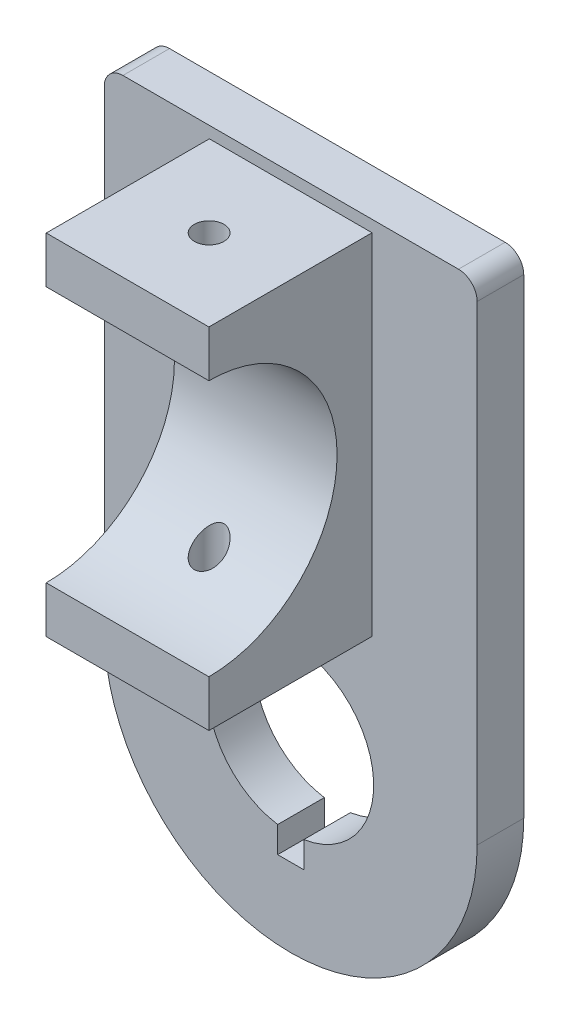
ISO-10303-21;
HEADER;
FILE_DESCRIPTION(('STEP AP214'),'2;1');
FILE_NAME('part.step','',(''),(''),'','','');
FILE_SCHEMA(('AUTOMOTIVE_DESIGN { 1 0 10303 214 1 1 1 1 }'));
ENDSEC;
DATA;
#1=APPLICATION_CONTEXT('core data for automotive mechanical design processes');
#2=APPLICATION_PROTOCOL_DEFINITION('international standard','automotive_design',2000,#1);
#3=PRODUCT_CONTEXT('',#1,'mechanical');
#4=PRODUCT('Part','Part','',(#3));
#5=PRODUCT_RELATED_PRODUCT_CATEGORY('part','',(#4));
#6=PRODUCT_DEFINITION_FORMATION('','',#4);
#7=PRODUCT_DEFINITION_CONTEXT('part definition',#1,'design');
#8=PRODUCT_DEFINITION('design','',#6,#7);
#9=PRODUCT_DEFINITION_SHAPE('','',#8);
#10=(LENGTH_UNIT() NAMED_UNIT(*) SI_UNIT(.MILLI.,.METRE.));
#11=(NAMED_UNIT(*) PLANE_ANGLE_UNIT() SI_UNIT($,.RADIAN.));
#12=(NAMED_UNIT(*) SI_UNIT($,.STERADIAN.) SOLID_ANGLE_UNIT());
#13=UNCERTAINTY_MEASURE_WITH_UNIT(LENGTH_MEASURE(1.E-05),#10,'distance_accuracy_value','');
#14=(GEOMETRIC_REPRESENTATION_CONTEXT(3) GLOBAL_UNCERTAINTY_ASSIGNED_CONTEXT((#13)) GLOBAL_UNIT_ASSIGNED_CONTEXT((#10,
#11,#12)) REPRESENTATION_CONTEXT('',''));
#15=CARTESIAN_POINT('',(0.,0.,0.));
#16=DIRECTION('',(0.,0.,1.));
#17=DIRECTION('',(1.,0.,0.));
#18=AXIS2_PLACEMENT_3D('',#15,#16,#17);
#19=CARTESIAN_POINT('',(14.31925,65.0875,28.575));
#20=DIRECTION('',(0.,-1.,0.));
#21=DIRECTION('',(0.,0.,-1.));
#22=AXIS2_PLACEMENT_3D('',#19,#20,#21);
#23=PLANE('',#22);
#24=DIRECTION('',(-1.,0.,0.));
#25=VECTOR('',#24,1.);
#26=CARTESIAN_POINT('',(14.31925,65.0875,6.35));
#27=LINE('',#26,#25);
#28=CARTESIAN_POINT('',(36.48075,65.0875,6.35));
#29=VERTEX_POINT('',#28);
#30=CARTESIAN_POINT('',(14.31925,65.0875,6.35));
#31=VERTEX_POINT('',#30);
#32=EDGE_CURVE('E95',#29,#31,#27,.T.);
#33=ORIENTED_EDGE('',*,*,#32,.T.);
#34=DIRECTION('',(0.,0.,-1.));
#35=VECTOR('',#34,1.);
#36=CARTESIAN_POINT('',(14.31925,65.0875,28.575));
#37=LINE('',#36,#35);
#38=CARTESIAN_POINT('',(14.31925,65.0875,28.575));
#39=VERTEX_POINT('',#38);
#40=EDGE_CURVE('E134',#39,#31,#37,.T.);
#41=ORIENTED_EDGE('',*,*,#40,.F.);
#42=DIRECTION('',(-1.,0.,0.));
#43=VECTOR('',#42,1.);
#44=CARTESIAN_POINT('',(14.31925,65.0875,28.575));
#45=LINE('',#44,#43);
#46=CARTESIAN_POINT('',(36.48075,65.0875,28.575));
#47=VERTEX_POINT('',#46);
#48=EDGE_CURVE('E74',#47,#39,#45,.T.);
#49=ORIENTED_EDGE('',*,*,#48,.F.);
#50=DIRECTION('',(0.,0.,-1.));
#51=VECTOR('',#50,1.);
#52=CARTESIAN_POINT('',(36.48075,65.0875,28.575));
#53=LINE('',#52,#51);
#54=EDGE_CURVE('E143',#47,#29,#53,.T.);
#55=ORIENTED_EDGE('',*,*,#54,.T.);
#56=EDGE_LOOP('',(#33,#41,#49,#55));
#57=FACE_BOUND('',#56,.T.);
#58=CARTESIAN_POINT('',(25.4,65.0875,17.4625));
#59=DIRECTION('',(0.,1.,0.));
#60=DIRECTION('',(0.,0.,1.));
#61=AXIS2_PLACEMENT_3D('',#58,#59,#60);
#62=CIRCLE('',#61,2.0193);
#63=CARTESIAN_POINT('',(25.4,65.0875,19.4818));
#64=VERTEX_POINT('',#63);
#65=EDGE_CURVE('E165',#64,#64,#62,.T.);
#66=ORIENTED_EDGE('',*,*,#65,.F.);
#67=EDGE_LOOP('',(#66));
#68=FACE_BOUND('',#67,.T.);
#69=ADVANCED_FACE('F51',(#57,#68),#23,.F.);
#70=CARTESIAN_POINT('',(0.,0.,28.575));
#71=DIRECTION('',(0.,0.,-1.));
#72=DIRECTION('',(-1.,0.,0.));
#73=AXIS2_PLACEMENT_3D('',#70,#71,#72);
#74=PLANE('',#73);
#75=DIRECTION('',(1.,0.,0.));
#76=VECTOR('',#75,1.);
#77=CARTESIAN_POINT('',(-167.497143269986,23.8125,28.575));
#78=LINE('',#77,#76);
#79=CARTESIAN_POINT('',(14.31925,23.8125,28.575));
#80=VERTEX_POINT('',#79);
#81=CARTESIAN_POINT('',(36.48075,23.8125,28.575));
#82=VERTEX_POINT('',#81);
#83=EDGE_CURVE('E66',#80,#82,#78,.T.);
#84=ORIENTED_EDGE('',*,*,#83,.F.);
#85=DIRECTION('',(0.,-1.,0.));
#86=VECTOR('',#85,1.);
#87=CARTESIAN_POINT('',(14.31925,17.4625,28.575));
#88=LINE('',#87,#86);
#89=CARTESIAN_POINT('',(14.31925,17.4625,28.575));
#90=VERTEX_POINT('',#89);
#91=EDGE_CURVE('E102',#80,#90,#88,.T.);
#92=ORIENTED_EDGE('',*,*,#91,.T.);
#93=DIRECTION('',(1.,0.,0.));
#94=VECTOR('',#93,1.);
#95=CARTESIAN_POINT('',(14.31925,17.4625,28.575));
#96=LINE('',#95,#94);
#97=CARTESIAN_POINT('',(36.48075,17.4625,28.575));
#98=VERTEX_POINT('',#97);
#99=EDGE_CURVE('E124',#90,#98,#96,.T.);
#100=ORIENTED_EDGE('',*,*,#99,.T.);
#101=DIRECTION('',(0.,1.,0.));
#102=VECTOR('',#101,1.);
#103=CARTESIAN_POINT('',(36.48075,17.4625,28.575));
#104=LINE('',#103,#102);
#105=EDGE_CURVE('E130',#98,#82,#104,.T.);
#106=ORIENTED_EDGE('',*,*,#105,.T.);
#107=EDGE_LOOP('',(#84,#92,#100,#106));
#108=FACE_BOUND('',#107,.T.);
#109=ADVANCED_FACE('F161',(#108),#74,.F.);
#110=CARTESIAN_POINT('',(14.31925,17.4625,28.575));
#111=DIRECTION('',(1.,0.,0.));
#112=DIRECTION('',(0.,0.,-1.));
#113=AXIS2_PLACEMENT_3D('',#110,#111,#112);
#114=PLANE('',#113);
#115=ORIENTED_EDGE('',*,*,#91,.F.);
#116=CARTESIAN_POINT('',(14.31925,41.275,28.575));
#117=DIRECTION('',(1.,0.,0.));
#118=DIRECTION('',(0.,0.,-1.));
#119=AXIS2_PLACEMENT_3D('',#116,#117,#118);
#120=CIRCLE('',#119,17.4625);
#121=CARTESIAN_POINT('',(14.31925,58.7375,28.575));
#122=VERTEX_POINT('',#121);
#123=EDGE_CURVE('E114',#80,#122,#120,.T.);
#124=ORIENTED_EDGE('',*,*,#123,.T.);
#125=EDGE_CURVE('E119',#39,#122,#88,.T.);
#126=ORIENTED_EDGE('',*,*,#125,.F.);
#127=ORIENTED_EDGE('',*,*,#40,.T.);
#128=DIRECTION('',(0.,-1.,0.));
#129=VECTOR('',#128,1.);
#130=CARTESIAN_POINT('',(14.31925,17.4625,6.35));
#131=LINE('',#130,#129);
#132=CARTESIAN_POINT('',(14.31925,17.4625,6.35));
#133=VERTEX_POINT('',#132);
#134=EDGE_CURVE('E121',#31,#133,#131,.T.);
#135=ORIENTED_EDGE('',*,*,#134,.T.);
#136=DIRECTION('',(0.,0.,-1.));
#137=VECTOR('',#136,1.);
#138=CARTESIAN_POINT('',(14.31925,17.4625,28.575));
#139=LINE('',#138,#137);
#140=EDGE_CURVE('E59',#90,#133,#139,.T.);
#141=ORIENTED_EDGE('',*,*,#140,.F.);
#142=EDGE_LOOP('',(#115,#124,#126,#127,#135,#141));
#143=FACE_BOUND('',#142,.T.);
#144=ADVANCED_FACE('F53',(#143),#114,.F.);
#145=CARTESIAN_POINT('',(14.31925,17.4625,28.575));
#146=DIRECTION('',(0.,1.,0.));
#147=DIRECTION('',(0.,0.,1.));
#148=AXIS2_PLACEMENT_3D('',#145,#146,#147);
#149=PLANE('',#148);
#150=CARTESIAN_POINT('',(25.4,17.4625,17.4625));
#151=DIRECTION('',(0.,-1.,0.));
#152=DIRECTION('',(0.,0.,-1.));
#153=AXIS2_PLACEMENT_3D('',#150,#151,#152);
#154=CIRCLE('',#153,2.0193);
#155=CARTESIAN_POINT('',(25.4,17.4625,15.4432));
#156=VERTEX_POINT('',#155);
#157=EDGE_CURVE('E173',#156,#156,#154,.T.);
#158=ORIENTED_EDGE('',*,*,#157,.F.);
#159=EDGE_LOOP('',(#158));
#160=FACE_BOUND('',#159,.T.);
#161=DIRECTION('',(1.,0.,0.));
#162=VECTOR('',#161,1.);
#163=CARTESIAN_POINT('',(14.31925,17.4625,6.35));
#164=LINE('',#163,#162);
#165=CARTESIAN_POINT('',(36.48075,17.4625,6.35));
#166=VERTEX_POINT('',#165);
#167=EDGE_CURVE('E137',#133,#166,#164,.T.);
#168=ORIENTED_EDGE('',*,*,#167,.T.);
#169=DIRECTION('',(0.,0.,-1.));
#170=VECTOR('',#169,1.);
#171=CARTESIAN_POINT('',(36.48075,17.4625,28.575));
#172=LINE('',#171,#170);
#173=EDGE_CURVE('E145',#98,#166,#172,.T.);
#174=ORIENTED_EDGE('',*,*,#173,.F.);
#175=ORIENTED_EDGE('',*,*,#99,.F.);
#176=ORIENTED_EDGE('',*,*,#140,.T.);
#177=EDGE_LOOP('',(#168,#174,#175,#176));
#178=FACE_BOUND('',#177,.T.);
#179=ADVANCED_FACE('F149',(#160,#178),#149,.F.);
#180=CARTESIAN_POINT('',(36.48075,17.4625,28.575));
#181=DIRECTION('',(-1.,0.,0.));
#182=DIRECTION('',(0.,0.,1.));
#183=AXIS2_PLACEMENT_3D('',#180,#181,#182);
#184=PLANE('',#183);
#185=CARTESIAN_POINT('',(36.48075,58.7375,28.575));
#186=VERTEX_POINT('',#185);
#187=EDGE_CURVE('E126',#186,#47,#104,.T.);
#188=ORIENTED_EDGE('',*,*,#187,.F.);
#189=CARTESIAN_POINT('',(36.48075,41.275,28.575));
#190=DIRECTION('',(-1.,0.,0.));
#191=DIRECTION('',(0.,0.,1.));
#192=AXIS2_PLACEMENT_3D('',#189,#190,#191);
#193=CIRCLE('',#192,17.4625);
#194=EDGE_CURVE('E12',#186,#82,#193,.T.);
#195=ORIENTED_EDGE('',*,*,#194,.T.);
#196=ORIENTED_EDGE('',*,*,#105,.F.);
#197=ORIENTED_EDGE('',*,*,#173,.T.);
#198=DIRECTION('',(0.,1.,0.));
#199=VECTOR('',#198,1.);
#200=CARTESIAN_POINT('',(36.48075,17.4625,6.35));
#201=LINE('',#200,#199);
#202=EDGE_CURVE('E139',#166,#29,#201,.T.);
#203=ORIENTED_EDGE('',*,*,#202,.T.);
#204=ORIENTED_EDGE('',*,*,#54,.F.);
#205=EDGE_LOOP('',(#188,#195,#196,#197,#203,#204));
#206=FACE_BOUND('',#205,.T.);
#207=ADVANCED_FACE('F157',(#206),#184,.F.);
#208=ORIENTED_EDGE('',*,*,#125,.T.);
#209=DIRECTION('',(1.,0.,0.));
#210=VECTOR('',#209,1.);
#211=CARTESIAN_POINT('',(-167.497143269986,58.7375,28.575));
#212=LINE('',#211,#210);
#213=EDGE_CURVE('E111',#122,#186,#212,.T.);
#214=ORIENTED_EDGE('',*,*,#213,.T.);
#215=ORIENTED_EDGE('',*,*,#187,.T.);
#216=ORIENTED_EDGE('',*,*,#48,.T.);
#217=EDGE_LOOP('',(#208,#214,#215,#216));
#218=FACE_BOUND('',#217,.T.);
#219=ADVANCED_FACE('F123',(#218),#74,.F.);
#220=CARTESIAN_POINT('',(0.,0.,6.35));
#221=DIRECTION('',(0.,0.,-1.));
#222=DIRECTION('',(-1.,0.,0.));
#223=AXIS2_PLACEMENT_3D('',#220,#221,#222);
#224=PLANE('',#223);
#225=ORIENTED_EDGE('',*,*,#134,.F.);
#226=ORIENTED_EDGE('',*,*,#32,.F.);
#227=ORIENTED_EDGE('',*,*,#202,.F.);
#228=ORIENTED_EDGE('',*,*,#167,.F.);
#229=EDGE_LOOP('',(#225,#226,#227,#228));
#230=FACE_BOUND('',#229,.T.);
#231=ADVANCED_FACE('F153',(#230),#224,.T.);
#232=CARTESIAN_POINT('',(-167.497143269986,41.275,28.575));
#233=DIRECTION('',(1.,0.,0.));
#234=DIRECTION('',(0.,0.,-1.));
#235=AXIS2_PLACEMENT_3D('',#232,#233,#234);
#236=CYLINDRICAL_SURFACE('',#235,17.4625);
#237=CARTESIAN_POINT('',(25.4,29.764364265602,15.4432));
#238=CARTESIAN_POINT('',(25.3122592718044,29.7643540389011,15.4432079473975));
#239=CARTESIAN_POINT('',(25.2243620647265,29.7577538606893,15.4489853333698));
#240=CARTESIAN_POINT('',(25.0517648064527,29.7321054565429,15.4715362775297));
#241=CARTESIAN_POINT('',(24.9670745779302,29.713021817907,15.4883411184956));
#242=CARTESIAN_POINT('',(24.8042121396086,29.6646119892568,15.5312729208189));
#243=CARTESIAN_POINT('',(24.7259847345147,29.635386814844,15.5573079971035));
#244=CARTESIAN_POINT('',(24.5762988653743,29.5688878081754,15.617073979871));
#245=CARTESIAN_POINT('',(24.5048414465263,29.5316127360229,15.6508060719426));
#246=CARTESIAN_POINT('',(24.3340081712448,29.4302364588276,15.7435049825142));
#247=CARTESIAN_POINT('',(24.2391748093696,29.3621980326722,15.8065277021773));
#248=CARTESIAN_POINT('',(24.0651828069852,29.2173169558608,15.9432464377974));
#249=CARTESIAN_POINT('',(23.9860662203462,29.1404515301677,16.0169701994643));
#250=CARTESIAN_POINT('',(23.8158551975317,28.9515490781008,16.2018531810736));
#251=CARTESIAN_POINT('',(23.7313901303539,28.8371296681454,16.3166850684273));
#252=CARTESIAN_POINT('',(23.5892718634715,28.6039803654973,16.5578279161062));
#253=CARTESIAN_POINT('',(23.531639007171,28.4852472755802,16.6841474996213));
#254=CARTESIAN_POINT('',(23.4424351752283,28.2452659355672,16.947567380029));
#255=CARTESIAN_POINT('',(23.4113138217016,28.1240087088805,17.0848120901165));
#256=CARTESIAN_POINT('',(23.3781269280378,27.8842915327864,17.3651042309452));
#257=CARTESIAN_POINT('',(23.3760408785521,27.7658296679032,17.5081474941899));
#258=CARTESIAN_POINT('',(23.4013539596187,27.5507071576876,17.7764751455293));
#259=CARTESIAN_POINT('',(23.4247640303423,27.4532790249299,17.9015160437594));
#260=CARTESIAN_POINT('',(23.4967873156507,27.265286175644,18.1495062026656));
#261=CARTESIAN_POINT('',(23.5453700670979,27.1747133145916,18.2724578064089));
#262=CARTESIAN_POINT('',(23.6578390798927,27.018991415948,18.4893875351961));
#263=CARTESIAN_POINT('',(23.7172486491976,26.9522346675116,18.5845262471737));
#264=CARTESIAN_POINT('',(23.8542715586337,26.8267841255361,18.7668307336767));
#265=CARTESIAN_POINT('',(23.931881580581,26.7680888653699,18.8539979574887));
#266=CARTESIAN_POINT('',(24.1055489870007,26.6602170058998,19.0169316008363));
#267=CARTESIAN_POINT('',(24.2017557348491,26.6111244323973,19.0925961918718));
#268=CARTESIAN_POINT('',(24.4102088435094,26.5251239079886,19.2269274938826));
#269=CARTESIAN_POINT('',(24.5224384977171,26.488203396693,19.2856117192502));
#270=CARTESIAN_POINT('',(24.7415998988108,26.4327280908985,19.374553562129));
#271=CARTESIAN_POINT('',(24.8468686848954,26.4122668784926,19.4077284360357));
#272=CARTESIAN_POINT('',(25.0628789732846,26.3822763931675,19.456527937448));
#273=CARTESIAN_POINT('',(25.1736160546975,26.3727384354286,19.4721665074446));
#274=CARTESIAN_POINT('',(25.3843416866813,26.3654010657166,19.484191673146));
#275=CARTESIAN_POINT('',(25.4841867124598,26.3664358714607,19.4824902782172));
#276=CARTESIAN_POINT('',(25.682028721436,26.3774402096332,19.4644714595078));
#277=CARTESIAN_POINT('',(25.7800261327263,26.3874076457344,19.4481574650412));
#278=CARTESIAN_POINT('',(25.9693802093503,26.4156430287022,19.402262438834));
#279=CARTESIAN_POINT('',(26.0608325079707,26.4337343405876,19.3729638947744));
#280=CARTESIAN_POINT('',(26.2370855346335,26.4776108289649,19.3025735999499));
#281=CARTESIAN_POINT('',(26.3218852532264,26.5033971702448,19.261480063826));
#282=CARTESIAN_POINT('',(26.4876696055114,26.5635962236537,19.1666622738602));
#283=CARTESIAN_POINT('',(26.5681763933698,26.598410399466,19.112360614505));
#284=CARTESIAN_POINT('',(26.7186479362264,26.6748926078241,18.9947762026232));
#285=CARTESIAN_POINT('',(26.788608728604,26.7165632044062,18.931490091478));
#286=CARTESIAN_POINT('',(26.9250186784407,26.8111267346754,18.7901484089269));
#287=CARTESIAN_POINT('',(26.9900545588457,26.8647653293799,18.7112315376084));
#288=CARTESIAN_POINT('',(27.1059249009584,26.9781383204874,18.5476085121798));
#289=CARTESIAN_POINT('',(27.1567516620482,27.0378759984344,18.4628992497185));
#290=CARTESIAN_POINT('',(27.2519319757171,27.1727988071142,18.2753740697419));
#291=CARTESIAN_POINT('',(27.2937378807405,27.2488879856149,18.171918404613));
#292=CARTESIAN_POINT('',(27.3592999610247,27.4061227599968,17.9632011638995));
#293=CARTESIAN_POINT('',(27.383046343794,27.48727107335,17.8579386401598));
#294=CARTESIAN_POINT('',(27.4165526011766,27.6693602194714,17.6273518551354));
#295=CARTESIAN_POINT('',(27.4226878549658,27.7710778337981,17.5021130168811));
#296=CARTESIAN_POINT('',(27.4124214265186,27.9775298355207,17.2550087783377));
#297=CARTESIAN_POINT('',(27.3959954716391,28.0822673531581,17.1331471554183));
#298=CARTESIAN_POINT('',(27.3371824327983,28.3104086499186,16.8748837751349));
#299=CARTESIAN_POINT('',(27.2908757067351,28.4339745090572,16.7395069921402));
#300=CARTESIAN_POINT('',(27.1697208484271,28.6785639083849,16.4795261809976));
#301=CARTESIAN_POINT('',(27.0948796606752,28.7995880595994,16.3549195407413));
#302=CARTESIAN_POINT('',(26.9390474441298,29.003467983659,16.1506860646533));
#303=CARTESIAN_POINT('',(26.8646670793497,29.0880923463151,16.0677670798104));
#304=CARTESIAN_POINT('',(26.6988722290177,29.2498086565153,15.9122133039931));
#305=CARTESIAN_POINT('',(26.6074897126462,29.3269143334213,15.8395596549251));
#306=CARTESIAN_POINT('',(26.4354705557419,29.4484621944399,15.726780955958));
#307=CARTESIAN_POINT('',(26.3592050855278,29.4959475038671,15.6832889585947));
#308=CARTESIAN_POINT('',(26.1975241908688,29.5819836509488,15.6052027873557));
#309=CARTESIAN_POINT('',(26.1121192534189,29.6205445714176,15.5705985671277));
#310=CARTESIAN_POINT('',(25.9505767039923,29.6792728982307,15.5182291200361));
#311=CARTESIAN_POINT('',(25.8758510355018,29.7015567193523,15.4985001372706));
#312=CARTESIAN_POINT('',(25.7225661981581,29.7365532031353,15.4676085940369));
#313=CARTESIAN_POINT('',(25.6440179551371,29.7492916137897,15.4564229869017));
#314=CARTESIAN_POINT('',(25.5373733057548,29.7592433483813,15.4476902270001));
#315=CARTESIAN_POINT('',(25.5099673205513,29.7611596772808,15.4460095165709));
#316=CARTESIAN_POINT('',(25.4550460403923,29.7637218771426,15.4437630361599));
#317=CARTESIAN_POINT('',(25.4275307231715,29.7643674744706,15.4431975063166));
#318=CARTESIAN_POINT('',(25.4,29.764364265602,15.4432));
#319=B_SPLINE_CURVE_WITH_KNOTS('',3,(#237,#238,#239,#240,#241,#242,#243,#244,#245,#246,#247,
#248,#249,#250,#251,#252,#253,#254,#255,#256,#257,#258,#259,#260,#261,#262,#263,#264,#265,#266,
#267,#268,#269,#270,#271,#272,#273,#274,#275,#276,#277,#278,#279,#280,#281,#282,#283,#284,#285,
#286,#287,#288,#289,#290,#291,#292,#293,#294,#295,#296,#297,#298,#299,#300,#301,#302,#303,#304,
#305,#306,#307,#308,#309,#310,#311,#312,#313,#314,#315,#316,#317,#318),.UNSPECIFIED.,.T.,.F.,(4,
2,2,2,2,2,2,2,2,2,2,2,2,2,2,2,2,2,2,2,2,2,2,2,2,2,2,2,2,2,2,2,2,2,2,2,2,2,2,2,4),(0.,
0.26308550977859,0.526920588030512,0.788199765698887,1.0495192159914,1.44523605574343,
1.84199787308628,2.3875059282724,2.93342690101486,3.4884318910956,4.04304482848944,
4.52189171179561,5.00016045937141,5.39019689224752,5.78016227151282,6.17340066892408,
6.56623200294547,6.90108251025402,7.23566660066255,7.53379483611347,7.83185312456187,
8.12372301712631,8.41563711214288,8.72386041192553,9.03219923837976,9.37730186326657,
9.7225911551983,10.1262637067719,10.5301549876733,11.0127059370777,11.4957764493373,
12.0605179040702,12.6251220041116,13.043525906061,13.4611508905834,13.7596396830349,
14.0577895770598,14.2981545826047,14.5378688651558,14.6204003796668,14.7029496642363),.UNSPECIFIED.);
#320=CARTESIAN_POINT('',(25.4,29.764364265602,15.4432));
#321=VERTEX_POINT('',#320);
#322=EDGE_CURVE('E168',#321,#321,#319,.T.);
#323=ORIENTED_EDGE('',*,*,#322,.F.);
#324=EDGE_LOOP('',(#323));
#325=FACE_BOUND('',#324,.T.);
#326=CARTESIAN_POINT('',(25.4,56.1831393879317,19.4818));
#327=CARTESIAN_POINT('',(25.5004817544828,56.1831363055823,19.4817933394634));
#328=CARTESIAN_POINT('',(25.6011085679559,56.1785425645845,19.4742503030523));
#329=CARTESIAN_POINT('',(25.7994414600134,56.1603023267038,19.4444484548877));
#330=CARTESIAN_POINT('',(25.8971407914309,56.1466363810596,19.4221580284038));
#331=CARTESIAN_POINT('',(26.0864247223378,56.110758582193,19.3641193212041));
#332=CARTESIAN_POINT('',(26.1780282699916,56.0885748165586,19.3284152802576));
#333=CARTESIAN_POINT('',(26.353239217456,56.0363581211616,19.2452835072752));
#334=CARTESIAN_POINT('',(26.4368488698566,56.0063274115366,19.1978590914929));
#335=CARTESIAN_POINT('',(26.5981954986308,55.9377073550164,19.0909015024089));
#336=CARTESIAN_POINT('',(26.675489821915,55.8987897461784,19.0309142034766));
#337=CARTESIAN_POINT('',(26.8187047891196,55.8142889312754,18.9026743973477));
#338=CARTESIAN_POINT('',(26.8846206163306,55.7687029173736,18.8344184105807));
#339=CARTESIAN_POINT('',(27.0126779533005,55.6653996309317,18.6823350042774));
#340=CARTESIAN_POINT('',(27.0731399296227,55.6068752824603,18.597645384758));
#341=CARTESIAN_POINT('',(27.1789951900858,55.4839274314133,18.4233157539871));
#342=CARTESIAN_POINT('',(27.2243795318194,55.4195004568367,18.3336728416075));
#343=CARTESIAN_POINT('',(27.3073697863668,55.2740908546973,18.1355563031787));
#344=CARTESIAN_POINT('',(27.3421564576118,55.1922017528028,18.0265692666583));
#345=CARTESIAN_POINT('',(27.3927103493853,55.0237209459441,17.8078883690642));
#346=CARTESIAN_POINT('',(27.4084682945255,54.9371269691018,17.698194189468));
#347=CARTESIAN_POINT('',(27.4235053401873,54.7435623787198,17.4590332961549));
#348=CARTESIAN_POINT('',(27.4189779682509,54.6359074521674,17.3298758647292));
#349=CARTESIAN_POINT('',(27.3861684041996,54.41839134195,17.0763827816163));
#350=CARTESIAN_POINT('',(27.3578520156244,54.3085272045952,16.9520543408737));
#351=CARTESIAN_POINT('',(27.2723796051174,54.0725029140575,16.6923279562329));
#352=CARTESIAN_POINT('',(27.2115307573422,53.9463735825719,16.5580721393816));
#353=CARTESIAN_POINT('',(27.0977090218493,53.7611285503092,16.3666638186129));
#354=CARTESIAN_POINT('',(27.0560103449882,53.7000383435488,16.3045235897213));
#355=CARTESIAN_POINT('',(26.9648890847517,53.5799121228696,16.1840657661648));
#356=CARTESIAN_POINT('',(26.9154707423457,53.5208750026868,16.1257460974128));
#357=CARTESIAN_POINT('',(26.7938007298509,53.3898282800357,15.9980226786348));
#358=CARTESIAN_POINT('',(26.7190170558514,53.3187595281723,15.9300281467929));
#359=CARTESIAN_POINT('',(26.5557432781354,53.1844391437912,15.8034437953159));
#360=CARTESIAN_POINT('',(26.4672771356151,53.1211741866683,15.7448378924491));
#361=CARTESIAN_POINT('',(26.299469163362,53.0205046168349,15.6527126114939));
#362=CARTESIAN_POINT('',(26.2231235083229,52.9805501694374,15.6165567843805));
#363=CARTESIAN_POINT('',(26.0627805418448,52.9099497706506,15.5531297545013));
#364=CARTESIAN_POINT('',(25.9787940331432,52.8792909349269,15.5258462502642));
#365=CARTESIAN_POINT('',(25.8189767059489,52.8339978829926,15.4857203268073));
#366=CARTESIAN_POINT('',(25.7440755452324,52.8175576880344,15.4712410482585));
#367=CARTESIAN_POINT('',(25.5916479674144,52.7943665623687,15.4508487231675));
#368=CARTESIAN_POINT('',(25.5141234447608,52.7876087861986,15.444929624557));
#369=CARTESIAN_POINT('',(25.3585483257275,52.784408644676,15.4421242646458));
#370=CARTESIAN_POINT('',(25.2804970183394,52.7879855205134,15.4452548521742));
#371=CARTESIAN_POINT('',(25.1263739617476,52.8051485579941,15.460324848763));
#372=CARTESIAN_POINT('',(25.0503031382219,52.8187393161557,15.4722683030617));
#373=CARTESIAN_POINT('',(24.9032448195697,52.8544653031902,15.5038318413734));
#374=CARTESIAN_POINT('',(24.8321960940695,52.8764624574487,15.5233279410065));
#375=CARTESIAN_POINT('',(24.6949617924702,52.9275263561437,15.5688972257603));
#376=CARTESIAN_POINT('',(24.6287783455647,52.9565961720893,15.5949732685959));
#377=CARTESIAN_POINT('',(24.4654931537798,53.0385553919658,15.6691027159889));
#378=CARTESIAN_POINT('',(24.3722960349598,53.0955719294047,15.7212067458716));
#379=CARTESIAN_POINT('',(24.1992249933994,53.2188614700401,15.8356822572463));
#380=CARTESIAN_POINT('',(24.1193898939583,53.285160452412,15.8980826462643));
#381=CARTESIAN_POINT('',(23.9423627926054,53.4521929105045,16.0580876866005));
#382=CARTESIAN_POINT('',(23.8515176042035,53.5558818853721,16.1596223279417));
#383=CARTESIAN_POINT('',(23.6938409296219,53.7691212108239,16.3742275518755));
#384=CARTESIAN_POINT('',(23.6270253934215,53.8786753993037,16.4873057329511));
#385=CARTESIAN_POINT('',(23.5153728359417,54.102750572874,16.7253131814414));
#386=CARTESIAN_POINT('',(23.4711315364025,54.2173271623107,16.8504691492868));
#387=CARTESIAN_POINT('',(23.4077036211337,54.4457872153333,17.1077029247921));
#388=CARTESIAN_POINT('',(23.388531859505,54.5596702282281,17.2397847879973));
#389=CARTESIAN_POINT('',(23.3760098176987,54.798171195546,17.5250475621378));
#390=CARTESIAN_POINT('',(23.3862145057488,54.9223354499275,17.6787911768663));
#391=CARTESIAN_POINT('',(23.4435355307611,55.1620930821754,17.9860774236105));
#392=CARTESIAN_POINT('',(23.4905776295072,55.2777031868667,18.1396198384102));
#393=CARTESIAN_POINT('',(23.6030593645055,55.4604770605132,18.3903532840495));
#394=CARTESIAN_POINT('',(23.6577072070215,55.5312588226551,18.48977805961));
#395=CARTESIAN_POINT('',(23.786006216399,55.6649467953281,18.6814700085097));
#396=CARTESIAN_POINT('',(23.8596462736419,55.7278575781958,18.7737413254085));
#397=CARTESIAN_POINT('',(24.0266255511721,55.844366185844,18.9477704721449));
#398=CARTESIAN_POINT('',(24.1201287001751,55.8978792875457,19.0294310863347));
#399=CARTESIAN_POINT('',(24.2733940893536,55.9689475831163,19.1394956038404));
#400=CARTESIAN_POINT('',(24.3266800382461,55.9911119802898,19.174126503164));
#401=CARTESIAN_POINT('',(24.4372513323745,56.0321432978679,19.2386685741979));
#402=CARTESIAN_POINT('',(24.4945356495603,56.0510110615554,19.2685809527209));
#403=CARTESIAN_POINT('',(24.6038483779536,56.0826701965785,19.3190525478547));
#404=CARTESIAN_POINT('',(24.6554017289756,56.0959475174514,19.340340753208));
#405=CARTESIAN_POINT('',(24.7606461975911,56.1197977401146,19.3787291748913));
#406=CARTESIAN_POINT('',(24.8143368959879,56.130371169227,19.39583020779));
#407=CARTESIAN_POINT('',(24.9232594127943,56.1486790361437,19.4255255737991));
#408=CARTESIAN_POINT('',(24.9784866035852,56.1564211762238,19.438132131355));
#409=CARTESIAN_POINT('',(25.0900960925571,56.1690197458444,19.4586834095598));
#410=CARTESIAN_POINT('',(25.1464775776368,56.173878138975,19.4666313023232));
#411=CARTESIAN_POINT('',(25.2358338690453,56.1792241975691,19.475383497993));
#412=CARTESIAN_POINT('',(25.2686028295553,56.1806915695782,19.477787746831));
#413=CARTESIAN_POINT('',(25.3342426808698,56.1826496672899,19.4809970847167));
#414=CARTESIAN_POINT('',(25.3671135712821,56.1831403967463,19.4818021799108));
#415=CARTESIAN_POINT('',(25.4,56.1831393879317,19.4818));
#416=B_SPLINE_CURVE_WITH_KNOTS('',3,(#326,#327,#328,#329,#330,#331,#332,#333,#334,#335,#336,
#337,#338,#339,#340,#341,#342,#343,#344,#345,#346,#347,#348,#349,#350,#351,#352,#353,#354,#355,
#356,#357,#358,#359,#360,#361,#362,#363,#364,#365,#366,#367,#368,#369,#370,#371,#372,#373,#374,
#375,#376,#377,#378,#379,#380,#381,#382,#383,#384,#385,#386,#387,#388,#389,#390,#391,#392,#393,
#394,#395,#396,#397,#398,#399,#400,#401,#402,#403,#404,#405,#406,#407,#408,#409,#410,#411,#412,
#413,#414,#415),.UNSPECIFIED.,.T.,.F.,(4,2,2,2,2,2,2,2,2,2,2,2,2,2,2,2,2,2,2,2,2,2,2,2,2,2,2,2,
2,2,2,2,2,2,2,2,2,2,2,2,2,2,2,2,4),(0.,0.30131763849344,0.60328332909668,0.904261719825624,
1.20515504670472,1.51979149109787,1.83456080151449,2.19136497463601,2.5483803888355,
2.96889566573211,3.3896158365356,3.89226302002937,4.39563399233493,4.9746095956516,
5.2640976274721,5.5534271783396,5.92296502819657,6.29186290935801,6.5712325631378,
6.85021320294252,7.08332197644093,7.31626586075677,7.54964372234213,7.78312877456624,
8.01293311054373,8.24283742443639,8.60391643838552,8.96602700846826,9.47692507104364,
9.9881616253703,10.5122698960952,11.0366885688234,11.6271342176056,12.2163929975518,
12.6160281769208,13.0154301152391,13.4182660940365,13.619879991273,13.8214422396771,
13.9932046770702,14.1649335911849,14.3361917938996,14.5073332499433,14.6059511450711,
14.7045686611642),.UNSPECIFIED.);
#417=CARTESIAN_POINT('',(25.4,56.1831393879317,19.4818));
#418=VERTEX_POINT('',#417);
#419=EDGE_CURVE('E167',#418,#418,#416,.T.);
#420=ORIENTED_EDGE('',*,*,#419,.T.);
#421=EDGE_LOOP('',(#420));
#422=FACE_BOUND('',#421,.T.);
#423=ORIENTED_EDGE('',*,*,#123,.F.);
#424=ORIENTED_EDGE('',*,*,#83,.T.);
#425=ORIENTED_EDGE('',*,*,#194,.F.);
#426=ORIENTED_EDGE('',*,*,#213,.F.);
#427=EDGE_LOOP('',(#423,#424,#425,#426));
#428=FACE_BOUND('',#427,.T.);
#429=ADVANCED_FACE('F113',(#325,#422,#428),#236,.F.);
#430=CARTESIAN_POINT('',(25.4,65.0875,17.4625));
#431=DIRECTION('',(0.,1.,0.));
#432=DIRECTION('',(0.,0.,1.));
#433=AXIS2_PLACEMENT_3D('',#430,#431,#432);
#434=CYLINDRICAL_SURFACE('',#433,2.0193);
#435=ORIENTED_EDGE('',*,*,#419,.F.);
#436=EDGE_LOOP('',(#435));
#437=FACE_BOUND('',#436,.T.);
#438=ORIENTED_EDGE('',*,*,#65,.T.);
#439=EDGE_LOOP('',(#438));
#440=FACE_BOUND('',#439,.T.);
#441=ADVANCED_FACE('F183',(#437,#440),#434,.F.);
#442=CARTESIAN_POINT('',(25.4,17.4625,17.4625));
#443=DIRECTION('',(0.,-1.,0.));
#444=DIRECTION('',(0.,0.,-1.));
#445=AXIS2_PLACEMENT_3D('',#442,#443,#444);
#446=CYLINDRICAL_SURFACE('',#445,2.0193);
#447=ORIENTED_EDGE('',*,*,#322,.T.);
#448=EDGE_LOOP('',(#447));
#449=FACE_BOUND('',#448,.T.);
#450=ORIENTED_EDGE('',*,*,#157,.T.);
#451=EDGE_LOOP('',(#450));
#452=FACE_BOUND('',#451,.T.);
#453=ADVANCED_FACE('F187',(#449,#452),#446,.F.);
#454=CLOSED_SHELL('',(#69,#109,#144,#179,#207,#219,#231,#429,#441,#453));
#455=MANIFOLD_SOLID_BREP('B2',#454);
#456=CARTESIAN_POINT('',(25.4,0.,6.35));
#457=DIRECTION('',(0.,0.,-1.));
#458=DIRECTION('',(-1.,0.,0.));
#459=AXIS2_PLACEMENT_3D('',#456,#457,#458);
#460=PLANE('',#459);
#461=CARTESIAN_POINT('',(25.4,0.,6.35));
#462=DIRECTION('',(0.,0.,1.));
#463=DIRECTION('',(-1.,0.,0.));
#464=AXIS2_PLACEMENT_3D('',#461,#462,#463);
#465=CIRCLE('',#464,25.4);
#466=CARTESIAN_POINT('',(0.,0.,6.35));
#467=VERTEX_POINT('',#466);
#468=CARTESIAN_POINT('',(50.8,0.,6.35));
#469=VERTEX_POINT('',#468);
#470=EDGE_CURVE('E427',#467,#469,#465,.T.);
#471=ORIENTED_EDGE('',*,*,#470,.T.);
#472=DIRECTION('',(0.,1.,0.));
#473=VECTOR('',#472,1.);
#474=CARTESIAN_POINT('',(50.8,64.135,6.35));
#475=LINE('',#474,#473);
#476=CARTESIAN_POINT('',(50.8,64.135,6.35));
#477=VERTEX_POINT('',#476);
#478=EDGE_CURVE('E430',#469,#477,#475,.T.);
#479=ORIENTED_EDGE('',*,*,#478,.T.);
#480=CARTESIAN_POINT('',(48.26,64.135,6.35));
#481=DIRECTION('',(0.,0.,1.));
#482=DIRECTION('',(-1.,0.,0.));
#483=AXIS2_PLACEMENT_3D('',#480,#481,#482);
#484=CIRCLE('',#483,2.54);
#485=CARTESIAN_POINT('',(48.26,66.675,6.35));
#486=VERTEX_POINT('',#485);
#487=EDGE_CURVE('E433',#477,#486,#484,.T.);
#488=ORIENTED_EDGE('',*,*,#487,.T.);
#489=DIRECTION('',(-1.,0.,0.));
#490=VECTOR('',#489,1.);
#491=CARTESIAN_POINT('',(2.54,66.675,6.35));
#492=LINE('',#491,#490);
#493=CARTESIAN_POINT('',(2.54,66.675,6.35));
#494=VERTEX_POINT('',#493);
#495=EDGE_CURVE('E435',#486,#494,#492,.T.);
#496=ORIENTED_EDGE('',*,*,#495,.T.);
#497=CARTESIAN_POINT('',(2.54,64.135,6.35));
#498=DIRECTION('',(0.,0.,1.));
#499=DIRECTION('',(-1.,0.,0.));
#500=AXIS2_PLACEMENT_3D('',#497,#498,#499);
#501=CIRCLE('',#500,2.54);
#502=CARTESIAN_POINT('',(0.,64.135,6.35));
#503=VERTEX_POINT('',#502);
#504=EDGE_CURVE('E437',#494,#503,#501,.T.);
#505=ORIENTED_EDGE('',*,*,#504,.T.);
#506=DIRECTION('',(0.,-1.,0.));
#507=VECTOR('',#506,1.);
#508=CARTESIAN_POINT('',(0.,0.,6.35));
#509=LINE('',#508,#507);
#510=EDGE_CURVE('E439',#503,#467,#509,.T.);
#511=ORIENTED_EDGE('',*,*,#510,.T.);
#512=EDGE_LOOP('',(#471,#479,#488,#496,#505,#511));
#513=FACE_BOUND('',#512,.T.);
#514=CARTESIAN_POINT('',(25.4,0.,6.35));
#515=DIRECTION('',(0.,0.,1.));
#516=DIRECTION('',(1.,0.,0.));
#517=AXIS2_PLACEMENT_3D('',#514,#515,#516);
#518=CIRCLE('',#517,11.303);
#519=CARTESIAN_POINT('',(27.178,-11.1622813528418,6.35));
#520=VERTEX_POINT('',#519);
#521=CARTESIAN_POINT('',(23.622,-11.1622813528418,6.35));
#522=VERTEX_POINT('',#521);
#523=EDGE_CURVE('E391',#520,#522,#518,.T.);
#524=ORIENTED_EDGE('',*,*,#523,.F.);
#525=DIRECTION('',(0.,1.,0.));
#526=VECTOR('',#525,1.);
#527=CARTESIAN_POINT('',(27.178,-14.7182813528418,6.35));
#528=LINE('',#527,#526);
#529=CARTESIAN_POINT('',(27.178,-14.7182813528418,6.35));
#530=VERTEX_POINT('',#529);
#531=EDGE_CURVE('E413',#530,#520,#528,.T.);
#532=ORIENTED_EDGE('',*,*,#531,.F.);
#533=DIRECTION('',(1.,0.,0.));
#534=VECTOR('',#533,1.);
#535=CARTESIAN_POINT('',(23.622,-14.7182813528418,6.35));
#536=LINE('',#535,#534);
#537=CARTESIAN_POINT('',(23.622,-14.7182813528418,6.35));
#538=VERTEX_POINT('',#537);
#539=EDGE_CURVE('E411',#538,#530,#536,.T.);
#540=ORIENTED_EDGE('',*,*,#539,.F.);
#541=DIRECTION('',(0.,-1.,0.));
#542=VECTOR('',#541,1.);
#543=CARTESIAN_POINT('',(23.622,-11.1622813528418,6.35));
#544=LINE('',#543,#542);
#545=EDGE_CURVE('E399',#522,#538,#544,.T.);
#546=ORIENTED_EDGE('',*,*,#545,.F.);
#547=EDGE_LOOP('',(#524,#532,#540,#546));
#548=FACE_BOUND('',#547,.T.);
#549=ADVANCED_FACE('F314',(#513,#548),#460,.F.);
#550=CARTESIAN_POINT('',(25.4,0.,0.));
#551=DIRECTION('',(0.,0.,-1.));
#552=DIRECTION('',(-1.,0.,0.));
#553=AXIS2_PLACEMENT_3D('',#550,#551,#552);
#554=PLANE('',#553);
#555=CARTESIAN_POINT('',(25.4,0.,0.));
#556=DIRECTION('',(0.,0.,1.));
#557=DIRECTION('',(-1.,0.,0.));
#558=AXIS2_PLACEMENT_3D('',#555,#556,#557);
#559=CIRCLE('',#558,25.4);
#560=CARTESIAN_POINT('',(0.,0.,0.));
#561=VERTEX_POINT('',#560);
#562=CARTESIAN_POINT('',(50.8,0.,0.));
#563=VERTEX_POINT('',#562);
#564=EDGE_CURVE('E407',#561,#563,#559,.T.);
#565=ORIENTED_EDGE('',*,*,#564,.F.);
#566=DIRECTION('',(0.,-1.,0.));
#567=VECTOR('',#566,1.);
#568=CARTESIAN_POINT('',(0.,0.,0.));
#569=LINE('',#568,#567);
#570=CARTESIAN_POINT('',(0.,64.135,0.));
#571=VERTEX_POINT('',#570);
#572=EDGE_CURVE('E431',#571,#561,#569,.T.);
#573=ORIENTED_EDGE('',*,*,#572,.F.);
#574=CARTESIAN_POINT('',(2.54,64.135,0.));
#575=DIRECTION('',(0.,0.,1.));
#576=DIRECTION('',(-1.,0.,0.));
#577=AXIS2_PLACEMENT_3D('',#574,#575,#576);
#578=CIRCLE('',#577,2.54);
#579=CARTESIAN_POINT('',(2.54,66.675,0.));
#580=VERTEX_POINT('',#579);
#581=EDGE_CURVE('E450',#580,#571,#578,.T.);
#582=ORIENTED_EDGE('',*,*,#581,.F.);
#583=DIRECTION('',(-1.,0.,0.));
#584=VECTOR('',#583,1.);
#585=CARTESIAN_POINT('',(2.54,66.675,0.));
#586=LINE('',#585,#584);
#587=CARTESIAN_POINT('',(48.26,66.675,0.));
#588=VERTEX_POINT('',#587);
#589=EDGE_CURVE('E448',#588,#580,#586,.T.);
#590=ORIENTED_EDGE('',*,*,#589,.F.);
#591=CARTESIAN_POINT('',(48.26,64.135,0.));
#592=DIRECTION('',(0.,0.,1.));
#593=DIRECTION('',(-1.,0.,0.));
#594=AXIS2_PLACEMENT_3D('',#591,#592,#593);
#595=CIRCLE('',#594,2.54);
#596=CARTESIAN_POINT('',(50.8,64.135,0.));
#597=VERTEX_POINT('',#596);
#598=EDGE_CURVE('E446',#597,#588,#595,.T.);
#599=ORIENTED_EDGE('',*,*,#598,.F.);
#600=DIRECTION('',(0.,1.,0.));
#601=VECTOR('',#600,1.);
#602=CARTESIAN_POINT('',(50.8,64.135,0.));
#603=LINE('',#602,#601);
#604=EDGE_CURVE('E444',#563,#597,#603,.T.);
#605=ORIENTED_EDGE('',*,*,#604,.F.);
#606=EDGE_LOOP('',(#565,#573,#582,#590,#599,#605));
#607=FACE_BOUND('',#606,.T.);
#608=DIRECTION('',(0.,1.,0.));
#609=VECTOR('',#608,1.);
#610=CARTESIAN_POINT('',(27.178,-14.7182813528418,0.));
#611=LINE('',#610,#609);
#612=CARTESIAN_POINT('',(27.178,-14.7182813528418,0.));
#613=VERTEX_POINT('',#612);
#614=CARTESIAN_POINT('',(27.178,-11.1622813528418,0.));
#615=VERTEX_POINT('',#614);
#616=EDGE_CURVE('E400',#613,#615,#611,.T.);
#617=ORIENTED_EDGE('',*,*,#616,.T.);
#618=CARTESIAN_POINT('',(25.4,0.,0.));
#619=DIRECTION('',(0.,0.,1.));
#620=DIRECTION('',(1.,0.,0.));
#621=AXIS2_PLACEMENT_3D('',#618,#619,#620);
#622=CIRCLE('',#621,11.303);
#623=CARTESIAN_POINT('',(23.622,-11.1622813528418,0.));
#624=VERTEX_POINT('',#623);
#625=EDGE_CURVE('E337',#615,#624,#622,.T.);
#626=ORIENTED_EDGE('',*,*,#625,.T.);
#627=DIRECTION('',(0.,-1.,0.));
#628=VECTOR('',#627,1.);
#629=CARTESIAN_POINT('',(23.622,-11.1622813528418,0.));
#630=LINE('',#629,#628);
#631=CARTESIAN_POINT('',(23.622,-14.7182813528418,0.));
#632=VERTEX_POINT('',#631);
#633=EDGE_CURVE('E406',#624,#632,#630,.T.);
#634=ORIENTED_EDGE('',*,*,#633,.T.);
#635=DIRECTION('',(1.,0.,0.));
#636=VECTOR('',#635,1.);
#637=CARTESIAN_POINT('',(23.622,-14.7182813528418,0.));
#638=LINE('',#637,#636);
#639=EDGE_CURVE('E419',#632,#613,#638,.T.);
#640=ORIENTED_EDGE('',*,*,#639,.T.);
#641=EDGE_LOOP('',(#617,#626,#634,#640));
#642=FACE_BOUND('',#641,.T.);
#643=ADVANCED_FACE('F474',(#607,#642),#554,.T.);
#644=CARTESIAN_POINT('',(25.4,0.,6.35));
#645=DIRECTION('',(0.,0.,-1.));
#646=DIRECTION('',(-1.,0.,0.));
#647=AXIS2_PLACEMENT_3D('',#644,#645,#646);
#648=CYLINDRICAL_SURFACE('',#647,25.4);
#649=ORIENTED_EDGE('',*,*,#564,.T.);
#650=DIRECTION('',(0.,0.,-1.));
#651=VECTOR('',#650,1.);
#652=CARTESIAN_POINT('',(50.8,0.,6.35));
#653=LINE('',#652,#651);
#654=EDGE_CURVE('E49',#469,#563,#653,.T.);
#655=ORIENTED_EDGE('',*,*,#654,.F.);
#656=ORIENTED_EDGE('',*,*,#470,.F.);
#657=DIRECTION('',(0.,0.,-1.));
#658=VECTOR('',#657,1.);
#659=CARTESIAN_POINT('',(0.,0.,6.35));
#660=LINE('',#659,#658);
#661=EDGE_CURVE('E441',#467,#561,#660,.T.);
#662=ORIENTED_EDGE('',*,*,#661,.T.);
#663=EDGE_LOOP('',(#649,#655,#656,#662));
#664=FACE_BOUND('',#663,.T.);
#665=ADVANCED_FACE('F316',(#664),#648,.T.);
#666=CARTESIAN_POINT('',(50.8,64.135,6.35));
#667=DIRECTION('',(-1.,0.,0.));
#668=DIRECTION('',(0.,-1.,0.));
#669=AXIS2_PLACEMENT_3D('',#666,#667,#668);
#670=PLANE('',#669);
#671=ORIENTED_EDGE('',*,*,#604,.T.);
#672=DIRECTION('',(0.,0.,-1.));
#673=VECTOR('',#672,1.);
#674=CARTESIAN_POINT('',(50.8,64.135,6.35));
#675=LINE('',#674,#673);
#676=EDGE_CURVE('E322',#477,#597,#675,.T.);
#677=ORIENTED_EDGE('',*,*,#676,.F.);
#678=ORIENTED_EDGE('',*,*,#478,.F.);
#679=ORIENTED_EDGE('',*,*,#654,.T.);
#680=EDGE_LOOP('',(#671,#677,#678,#679));
#681=FACE_BOUND('',#680,.T.);
#682=ADVANCED_FACE('F491',(#681),#670,.F.);
#683=CARTESIAN_POINT('',(48.26,64.135,6.35));
#684=DIRECTION('',(0.,0.,-1.));
#685=DIRECTION('',(-1.,0.,0.));
#686=AXIS2_PLACEMENT_3D('',#683,#684,#685);
#687=CYLINDRICAL_SURFACE('',#686,2.54);
#688=ORIENTED_EDGE('',*,*,#598,.T.);
#689=DIRECTION('',(0.,0.,-1.));
#690=VECTOR('',#689,1.);
#691=CARTESIAN_POINT('',(48.26,66.675,6.35));
#692=LINE('',#691,#690);
#693=EDGE_CURVE('E461',#486,#588,#692,.T.);
#694=ORIENTED_EDGE('',*,*,#693,.F.);
#695=ORIENTED_EDGE('',*,*,#487,.F.);
#696=ORIENTED_EDGE('',*,*,#676,.T.);
#697=EDGE_LOOP('',(#688,#694,#695,#696));
#698=FACE_BOUND('',#697,.T.);
#699=ADVANCED_FACE('F468',(#698),#687,.T.);
#700=CARTESIAN_POINT('',(2.54,66.675,6.35));
#701=DIRECTION('',(0.,-1.,0.));
#702=DIRECTION('',(0.,0.,-1.));
#703=AXIS2_PLACEMENT_3D('',#700,#701,#702);
#704=PLANE('',#703);
#705=ORIENTED_EDGE('',*,*,#589,.T.);
#706=DIRECTION('',(0.,0.,-1.));
#707=VECTOR('',#706,1.);
#708=CARTESIAN_POINT('',(2.54,66.675,6.35));
#709=LINE('',#708,#707);
#710=EDGE_CURVE('E458',#494,#580,#709,.T.);
#711=ORIENTED_EDGE('',*,*,#710,.F.);
#712=ORIENTED_EDGE('',*,*,#495,.F.);
#713=ORIENTED_EDGE('',*,*,#693,.T.);
#714=EDGE_LOOP('',(#705,#711,#712,#713));
#715=FACE_BOUND('',#714,.T.);
#716=ADVANCED_FACE('F480',(#715),#704,.F.);
#717=CARTESIAN_POINT('',(2.54,64.135,6.35));
#718=DIRECTION('',(0.,0.,-1.));
#719=DIRECTION('',(-1.,0.,0.));
#720=AXIS2_PLACEMENT_3D('',#717,#718,#719);
#721=CYLINDRICAL_SURFACE('',#720,2.54);
#722=ORIENTED_EDGE('',*,*,#581,.T.);
#723=DIRECTION('',(0.,0.,-1.));
#724=VECTOR('',#723,1.);
#725=CARTESIAN_POINT('',(0.,64.135,6.35));
#726=LINE('',#725,#724);
#727=EDGE_CURVE('E455',#503,#571,#726,.T.);
#728=ORIENTED_EDGE('',*,*,#727,.F.);
#729=ORIENTED_EDGE('',*,*,#504,.F.);
#730=ORIENTED_EDGE('',*,*,#710,.T.);
#731=EDGE_LOOP('',(#722,#728,#729,#730));
#732=FACE_BOUND('',#731,.T.);
#733=ADVANCED_FACE('F484',(#732),#721,.T.);
#734=CARTESIAN_POINT('',(0.,0.,6.35));
#735=DIRECTION('',(1.,0.,0.));
#736=DIRECTION('',(0.,0.,-1.));
#737=AXIS2_PLACEMENT_3D('',#734,#735,#736);
#738=PLANE('',#737);
#739=ORIENTED_EDGE('',*,*,#572,.T.);
#740=ORIENTED_EDGE('',*,*,#661,.F.);
#741=ORIENTED_EDGE('',*,*,#510,.F.);
#742=ORIENTED_EDGE('',*,*,#727,.T.);
#743=EDGE_LOOP('',(#739,#740,#741,#742));
#744=FACE_BOUND('',#743,.T.);
#745=ADVANCED_FACE('F494',(#744),#738,.F.);
#746=CARTESIAN_POINT('',(25.4,0.,6.35));
#747=DIRECTION('',(0.,0.,-1.));
#748=DIRECTION('',(-1.,0.,0.));
#749=AXIS2_PLACEMENT_3D('',#746,#747,#748);
#750=CYLINDRICAL_SURFACE('',#749,11.303);
#751=ORIENTED_EDGE('',*,*,#625,.F.);
#752=DIRECTION('',(0.,0.,-1.));
#753=VECTOR('',#752,1.);
#754=CARTESIAN_POINT('',(27.178,-11.1622813528418,6.35));
#755=LINE('',#754,#753);
#756=EDGE_CURVE('E395',#520,#615,#755,.T.);
#757=ORIENTED_EDGE('',*,*,#756,.F.);
#758=ORIENTED_EDGE('',*,*,#523,.T.);
#759=DIRECTION('',(0.,0.,-1.));
#760=VECTOR('',#759,1.);
#761=CARTESIAN_POINT('',(23.622,-11.1622813528418,6.35));
#762=LINE('',#761,#760);
#763=EDGE_CURVE('E394',#522,#624,#762,.T.);
#764=ORIENTED_EDGE('',*,*,#763,.T.);
#765=EDGE_LOOP('',(#751,#757,#758,#764));
#766=FACE_BOUND('',#765,.T.);
#767=ADVANCED_FACE('F393',(#766),#750,.F.);
#768=CARTESIAN_POINT('',(23.622,-11.1622813528418,6.35));
#769=DIRECTION('',(1.,0.,0.));
#770=DIRECTION('',(0.,0.,-1.));
#771=AXIS2_PLACEMENT_3D('',#768,#769,#770);
#772=PLANE('',#771);
#773=ORIENTED_EDGE('',*,*,#633,.F.);
#774=ORIENTED_EDGE('',*,*,#763,.F.);
#775=ORIENTED_EDGE('',*,*,#545,.T.);
#776=DIRECTION('',(0.,0.,-1.));
#777=VECTOR('',#776,1.);
#778=CARTESIAN_POINT('',(23.622,-14.7182813528418,6.35));
#779=LINE('',#778,#777);
#780=EDGE_CURVE('E408',#538,#632,#779,.T.);
#781=ORIENTED_EDGE('',*,*,#780,.T.);
#782=EDGE_LOOP('',(#773,#774,#775,#781));
#783=FACE_BOUND('',#782,.T.);
#784=ADVANCED_FACE('F403',(#783),#772,.T.);
#785=CARTESIAN_POINT('',(23.622,-14.7182813528418,6.35));
#786=DIRECTION('',(0.,1.,0.));
#787=DIRECTION('',(0.,0.,1.));
#788=AXIS2_PLACEMENT_3D('',#785,#786,#787);
#789=PLANE('',#788);
#790=ORIENTED_EDGE('',*,*,#639,.F.);
#791=ORIENTED_EDGE('',*,*,#780,.F.);
#792=ORIENTED_EDGE('',*,*,#539,.T.);
#793=DIRECTION('',(0.,0.,-1.));
#794=VECTOR('',#793,1.);
#795=CARTESIAN_POINT('',(27.178,-14.7182813528418,6.35));
#796=LINE('',#795,#794);
#797=EDGE_CURVE('E329',#530,#613,#796,.T.);
#798=ORIENTED_EDGE('',*,*,#797,.T.);
#799=EDGE_LOOP('',(#790,#791,#792,#798));
#800=FACE_BOUND('',#799,.T.);
#801=ADVANCED_FACE('F512',(#800),#789,.T.);
#802=CARTESIAN_POINT('',(27.178,-14.7182813528418,6.35));
#803=DIRECTION('',(-1.,0.,0.));
#804=DIRECTION('',(0.,0.,1.));
#805=AXIS2_PLACEMENT_3D('',#802,#803,#804);
#806=PLANE('',#805);
#807=ORIENTED_EDGE('',*,*,#616,.F.);
#808=ORIENTED_EDGE('',*,*,#797,.F.);
#809=ORIENTED_EDGE('',*,*,#531,.T.);
#810=ORIENTED_EDGE('',*,*,#756,.T.);
#811=EDGE_LOOP('',(#807,#808,#809,#810));
#812=FACE_BOUND('',#811,.T.);
#813=ADVANCED_FACE('F515',(#812),#806,.T.);
#814=CLOSED_SHELL('',(#549,#643,#665,#682,#699,#716,#733,#745,#767,#784,#801,#813));
#815=MANIFOLD_SOLID_BREP('B6',#814);
#816=ADVANCED_BREP_SHAPE_REPRESENTATION('',(#18,#455,#815),#14);
#817=SHAPE_DEFINITION_REPRESENTATION(#9,#816);
ENDSEC;
END-ISO-10303-21;
